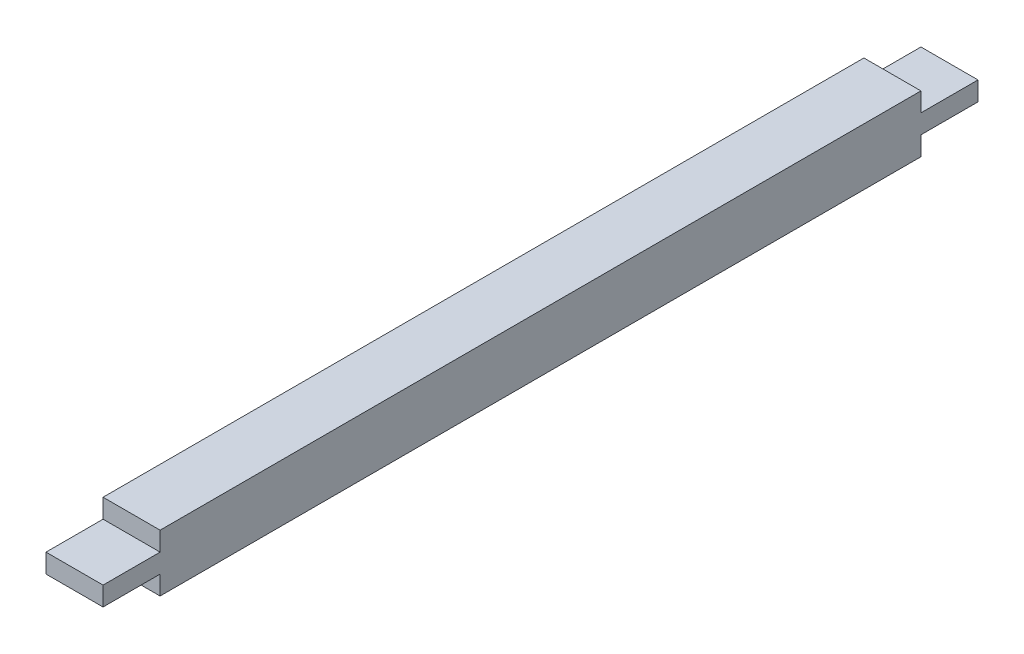
ISO-10303-21;
HEADER;
FILE_DESCRIPTION(('STEP AP214'),'2;1');
FILE_NAME('part.step','',(''),(''),'','','');
FILE_SCHEMA(('AUTOMOTIVE_DESIGN { 1 0 10303 214 1 1 1 1 }'));
ENDSEC;
DATA;
#1=APPLICATION_CONTEXT('core data for automotive mechanical design processes');
#2=APPLICATION_PROTOCOL_DEFINITION('international standard','automotive_design',2000,#1);
#3=PRODUCT_CONTEXT('',#1,'mechanical');
#4=PRODUCT('Part','Part','',(#3));
#5=PRODUCT_RELATED_PRODUCT_CATEGORY('part','',(#4));
#6=PRODUCT_DEFINITION_FORMATION('','',#4);
#7=PRODUCT_DEFINITION_CONTEXT('part definition',#1,'design');
#8=PRODUCT_DEFINITION('design','',#6,#7);
#9=PRODUCT_DEFINITION_SHAPE('','',#8);
#10=(LENGTH_UNIT() NAMED_UNIT(*) SI_UNIT(.MILLI.,.METRE.));
#11=(NAMED_UNIT(*) PLANE_ANGLE_UNIT() SI_UNIT($,.RADIAN.));
#12=(NAMED_UNIT(*) SI_UNIT($,.STERADIAN.) SOLID_ANGLE_UNIT());
#13=UNCERTAINTY_MEASURE_WITH_UNIT(LENGTH_MEASURE(1.E-05),#10,'distance_accuracy_value','');
#14=(GEOMETRIC_REPRESENTATION_CONTEXT(3) GLOBAL_UNCERTAINTY_ASSIGNED_CONTEXT((#13)) GLOBAL_UNIT_ASSIGNED_CONTEXT((#10,
#11,#12)) REPRESENTATION_CONTEXT('',''));
#15=CARTESIAN_POINT('',(0.,0.,0.));
#16=DIRECTION('',(0.,0.,1.));
#17=DIRECTION('',(1.,0.,0.));
#18=AXIS2_PLACEMENT_3D('',#15,#16,#17);
#19=CARTESIAN_POINT('',(0.,5.,0.));
#20=DIRECTION('',(0.,-1.,0.));
#21=DIRECTION('',(0.,0.,-1.));
#22=AXIS2_PLACEMENT_3D('',#19,#20,#21);
#23=PLANE('',#22);
#24=DIRECTION('',(-1.,0.,0.));
#25=VECTOR('',#24,1.);
#26=CARTESIAN_POINT('',(0.,5.,-200.));
#27=LINE('',#26,#25);
#28=CARTESIAN_POINT('',(-150.002980915945,5.,-200.));
#29=VERTEX_POINT('',#28);
#30=CARTESIAN_POINT('',(-179.997019084055,5.,-200.));
#31=VERTEX_POINT('',#30);
#32=EDGE_CURVE('E148',#29,#31,#27,.T.);
#33=ORIENTED_EDGE('',*,*,#32,.F.);
#34=DIRECTION('',(0.,0.,-1.));
#35=VECTOR('',#34,1.);
#36=CARTESIAN_POINT('',(-150.002980915945,5.,230.));
#37=LINE('',#36,#35);
#38=CARTESIAN_POINT('',(-150.002980915945,5.,-230.));
#39=VERTEX_POINT('',#38);
#40=EDGE_CURVE('E145',#29,#39,#37,.T.);
#41=ORIENTED_EDGE('',*,*,#40,.T.);
#42=DIRECTION('',(-1.,0.,0.));
#43=VECTOR('',#42,1.);
#44=CARTESIAN_POINT('',(-179.997019084055,5.,-230.));
#45=LINE('',#44,#43);
#46=CARTESIAN_POINT('',(-179.997019084055,5.,-230.));
#47=VERTEX_POINT('',#46);
#48=EDGE_CURVE('E157',#39,#47,#45,.T.);
#49=ORIENTED_EDGE('',*,*,#48,.T.);
#50=DIRECTION('',(0.,0.,1.));
#51=VECTOR('',#50,1.);
#52=CARTESIAN_POINT('',(-179.997019084055,5.,230.));
#53=LINE('',#52,#51);
#54=EDGE_CURVE('E56',#47,#31,#53,.T.);
#55=ORIENTED_EDGE('',*,*,#54,.T.);
#56=EDGE_LOOP('',(#33,#41,#49,#55));
#57=FACE_BOUND('',#56,.T.);
#58=ADVANCED_FACE('F33',(#57),#23,.F.);
#59=DIRECTION('',(1.,0.,0.));
#60=VECTOR('',#59,1.);
#61=CARTESIAN_POINT('',(0.,5.,200.));
#62=LINE('',#61,#60);
#63=CARTESIAN_POINT('',(-179.997019084055,5.,200.));
#64=VERTEX_POINT('',#63);
#65=CARTESIAN_POINT('',(-150.002980915945,5.,200.));
#66=VERTEX_POINT('',#65);
#67=EDGE_CURVE('E48',#64,#66,#62,.T.);
#68=ORIENTED_EDGE('',*,*,#67,.F.);
#69=CARTESIAN_POINT('',(-179.997019084055,5.,230.));
#70=VERTEX_POINT('',#69);
#71=EDGE_CURVE('E159',#64,#70,#53,.T.);
#72=ORIENTED_EDGE('',*,*,#71,.T.);
#73=DIRECTION('',(1.,0.,0.));
#74=VECTOR('',#73,1.);
#75=CARTESIAN_POINT('',(-179.997019084055,5.,230.));
#76=LINE('',#75,#74);
#77=CARTESIAN_POINT('',(-150.002980915945,5.,230.));
#78=VERTEX_POINT('',#77);
#79=EDGE_CURVE('E161',#70,#78,#76,.T.);
#80=ORIENTED_EDGE('',*,*,#79,.T.);
#81=EDGE_CURVE('E155',#78,#66,#37,.T.);
#82=ORIENTED_EDGE('',*,*,#81,.T.);
#83=EDGE_LOOP('',(#68,#72,#80,#82));
#84=FACE_BOUND('',#83,.T.);
#85=ADVANCED_FACE('F240',(#84),#23,.F.);
#86=CARTESIAN_POINT('',(0.,-5.,0.));
#87=DIRECTION('',(0.,-1.,0.));
#88=DIRECTION('',(0.,0.,-1.));
#89=AXIS2_PLACEMENT_3D('',#86,#87,#88);
#90=PLANE('',#89);
#91=DIRECTION('',(0.,0.,-1.));
#92=VECTOR('',#91,1.);
#93=CARTESIAN_POINT('',(-150.002980915945,-5.,230.));
#94=LINE('',#93,#92);
#95=CARTESIAN_POINT('',(-150.002980915945,-5.,-200.));
#96=VERTEX_POINT('',#95);
#97=CARTESIAN_POINT('',(-150.002980915945,-5.,-230.));
#98=VERTEX_POINT('',#97);
#99=EDGE_CURVE('E154',#96,#98,#94,.T.);
#100=ORIENTED_EDGE('',*,*,#99,.F.);
#101=DIRECTION('',(-1.,0.,0.));
#102=VECTOR('',#101,1.);
#103=CARTESIAN_POINT('',(0.,-5.,-200.));
#104=LINE('',#103,#102);
#105=CARTESIAN_POINT('',(-179.997019084055,-5.,-200.));
#106=VERTEX_POINT('',#105);
#107=EDGE_CURVE('E11',#96,#106,#104,.T.);
#108=ORIENTED_EDGE('',*,*,#107,.T.);
#109=DIRECTION('',(0.,0.,1.));
#110=VECTOR('',#109,1.);
#111=CARTESIAN_POINT('',(-179.997019084055,-5.,230.));
#112=LINE('',#111,#110);
#113=CARTESIAN_POINT('',(-179.997019084055,-5.,-230.));
#114=VERTEX_POINT('',#113);
#115=EDGE_CURVE('E170',#114,#106,#112,.T.);
#116=ORIENTED_EDGE('',*,*,#115,.F.);
#117=DIRECTION('',(-1.,0.,0.));
#118=VECTOR('',#117,1.);
#119=CARTESIAN_POINT('',(-179.997019084055,-5.,-230.));
#120=LINE('',#119,#118);
#121=EDGE_CURVE('E167',#98,#114,#120,.T.);
#122=ORIENTED_EDGE('',*,*,#121,.F.);
#123=EDGE_LOOP('',(#100,#108,#116,#122));
#124=FACE_BOUND('',#123,.T.);
#125=ADVANCED_FACE('F245',(#124),#90,.T.);
#126=CARTESIAN_POINT('',(-179.997019084055,-5.,200.));
#127=VERTEX_POINT('',#126);
#128=CARTESIAN_POINT('',(-179.997019084055,-5.,230.));
#129=VERTEX_POINT('',#128);
#130=EDGE_CURVE('E169',#127,#129,#112,.T.);
#131=ORIENTED_EDGE('',*,*,#130,.F.);
#132=DIRECTION('',(1.,0.,0.));
#133=VECTOR('',#132,1.);
#134=CARTESIAN_POINT('',(0.,-5.,200.));
#135=LINE('',#134,#133);
#136=CARTESIAN_POINT('',(-150.002980915945,-5.,200.));
#137=VERTEX_POINT('',#136);
#138=EDGE_CURVE('E41',#127,#137,#135,.T.);
#139=ORIENTED_EDGE('',*,*,#138,.T.);
#140=CARTESIAN_POINT('',(-150.002980915945,-5.,230.));
#141=VERTEX_POINT('',#140);
#142=EDGE_CURVE('E164',#141,#137,#94,.T.);
#143=ORIENTED_EDGE('',*,*,#142,.F.);
#144=DIRECTION('',(1.,0.,0.));
#145=VECTOR('',#144,1.);
#146=CARTESIAN_POINT('',(-179.997019084055,-5.,230.));
#147=LINE('',#146,#145);
#148=EDGE_CURVE('E173',#129,#141,#147,.T.);
#149=ORIENTED_EDGE('',*,*,#148,.F.);
#150=EDGE_LOOP('',(#131,#139,#143,#149));
#151=FACE_BOUND('',#150,.T.);
#152=ADVANCED_FACE('F189',(#151),#90,.T.);
#153=CARTESIAN_POINT('',(-150.002980915945,5.,230.));
#154=DIRECTION('',(-1.,0.,0.));
#155=DIRECTION('',(0.,0.,1.));
#156=AXIS2_PLACEMENT_3D('',#153,#154,#155);
#157=PLANE('',#156);
#158=DIRECTION('',(0.,-1.,0.));
#159=VECTOR('',#158,1.);
#160=CARTESIAN_POINT('',(-150.002980915945,15.,200.));
#161=LINE('',#160,#159);
#162=CARTESIAN_POINT('',(-150.002980915945,15.,200.));
#163=VERTEX_POINT('',#162);
#164=EDGE_CURVE('E212',#163,#66,#161,.T.);
#165=ORIENTED_EDGE('',*,*,#164,.T.);
#166=ORIENTED_EDGE('',*,*,#81,.F.);
#167=DIRECTION('',(0.,-1.,0.));
#168=VECTOR('',#167,1.);
#169=CARTESIAN_POINT('',(-150.002980915945,5.,230.));
#170=LINE('',#169,#168);
#171=EDGE_CURVE('E163',#78,#141,#170,.T.);
#172=ORIENTED_EDGE('',*,*,#171,.T.);
#173=ORIENTED_EDGE('',*,*,#142,.T.);
#174=CARTESIAN_POINT('',(-150.002980915945,-15.,200.));
#175=VERTEX_POINT('',#174);
#176=EDGE_CURVE('E194',#137,#175,#161,.T.);
#177=ORIENTED_EDGE('',*,*,#176,.T.);
#178=DIRECTION('',(0.,0.,-1.));
#179=VECTOR('',#178,1.);
#180=CARTESIAN_POINT('',(-150.002980915945,-15.,200.));
#181=LINE('',#180,#179);
#182=CARTESIAN_POINT('',(-150.002980915945,-15.,-200.));
#183=VERTEX_POINT('',#182);
#184=EDGE_CURVE('E221',#175,#183,#181,.T.);
#185=ORIENTED_EDGE('',*,*,#184,.T.);
#186=DIRECTION('',(0.,-1.,0.));
#187=VECTOR('',#186,1.);
#188=CARTESIAN_POINT('',(-150.002980915945,15.,-200.));
#189=LINE('',#188,#187);
#190=EDGE_CURVE('E146',#96,#183,#189,.T.);
#191=ORIENTED_EDGE('',*,*,#190,.F.);
#192=ORIENTED_EDGE('',*,*,#99,.T.);
#193=DIRECTION('',(0.,-1.,0.));
#194=VECTOR('',#193,1.);
#195=CARTESIAN_POINT('',(-150.002980915945,5.,-230.));
#196=LINE('',#195,#194);
#197=EDGE_CURVE('E183',#39,#98,#196,.T.);
#198=ORIENTED_EDGE('',*,*,#197,.F.);
#199=ORIENTED_EDGE('',*,*,#40,.F.);
#200=CARTESIAN_POINT('',(-150.002980915945,15.,-200.));
#201=VERTEX_POINT('',#200);
#202=EDGE_CURVE('E126',#201,#29,#189,.T.);
#203=ORIENTED_EDGE('',*,*,#202,.F.);
#204=DIRECTION('',(0.,0.,-1.));
#205=VECTOR('',#204,1.);
#206=CARTESIAN_POINT('',(-150.002980915945,15.,200.));
#207=LINE('',#206,#205);
#208=EDGE_CURVE('E132',#163,#201,#207,.T.);
#209=ORIENTED_EDGE('',*,*,#208,.F.);
#210=EDGE_LOOP('',(#165,#166,#172,#173,#177,#185,#191,#192,#198,#199,#203,#209));
#211=FACE_BOUND('',#210,.T.);
#212=ADVANCED_FACE('F35',(#211),#157,.F.);
#213=CARTESIAN_POINT('',(-179.997019084055,5.,-230.));
#214=DIRECTION('',(0.,0.,1.));
#215=DIRECTION('',(1.,0.,0.));
#216=AXIS2_PLACEMENT_3D('',#213,#214,#215);
#217=PLANE('',#216);
#218=ORIENTED_EDGE('',*,*,#121,.T.);
#219=DIRECTION('',(0.,-1.,0.));
#220=VECTOR('',#219,1.);
#221=CARTESIAN_POINT('',(-179.997019084055,5.,-230.));
#222=LINE('',#221,#220);
#223=EDGE_CURVE('E180',#47,#114,#222,.T.);
#224=ORIENTED_EDGE('',*,*,#223,.F.);
#225=ORIENTED_EDGE('',*,*,#48,.F.);
#226=ORIENTED_EDGE('',*,*,#197,.T.);
#227=EDGE_LOOP('',(#218,#224,#225,#226));
#228=FACE_BOUND('',#227,.T.);
#229=ADVANCED_FACE('F253',(#228),#217,.F.);
#230=CARTESIAN_POINT('',(-179.997019084055,5.,230.));
#231=DIRECTION('',(1.,0.,0.));
#232=DIRECTION('',(0.,0.,-1.));
#233=AXIS2_PLACEMENT_3D('',#230,#231,#232);
#234=PLANE('',#233);
#235=DIRECTION('',(0.,-1.,0.));
#236=VECTOR('',#235,1.);
#237=CARTESIAN_POINT('',(-179.997019084055,15.,200.));
#238=LINE('',#237,#236);
#239=CARTESIAN_POINT('',(-179.997019084055,-15.,200.));
#240=VERTEX_POINT('',#239);
#241=EDGE_CURVE('E207',#127,#240,#238,.T.);
#242=ORIENTED_EDGE('',*,*,#241,.F.);
#243=ORIENTED_EDGE('',*,*,#130,.T.);
#244=DIRECTION('',(0.,-1.,0.));
#245=VECTOR('',#244,1.);
#246=CARTESIAN_POINT('',(-179.997019084055,5.,230.));
#247=LINE('',#246,#245);
#248=EDGE_CURVE('E177',#70,#129,#247,.T.);
#249=ORIENTED_EDGE('',*,*,#248,.F.);
#250=ORIENTED_EDGE('',*,*,#71,.F.);
#251=CARTESIAN_POINT('',(-179.997019084055,15.,200.));
#252=VERTEX_POINT('',#251);
#253=EDGE_CURVE('E211',#252,#64,#238,.T.);
#254=ORIENTED_EDGE('',*,*,#253,.F.);
#255=DIRECTION('',(0.,0.,1.));
#256=VECTOR('',#255,1.);
#257=CARTESIAN_POINT('',(-179.997019084055,15.,200.));
#258=LINE('',#257,#256);
#259=CARTESIAN_POINT('',(-179.997019084055,15.,-200.));
#260=VERTEX_POINT('',#259);
#261=EDGE_CURVE('E131',#260,#252,#258,.T.);
#262=ORIENTED_EDGE('',*,*,#261,.F.);
#263=DIRECTION('',(0.,-1.,0.));
#264=VECTOR('',#263,1.);
#265=CARTESIAN_POINT('',(-179.997019084055,15.,-200.));
#266=LINE('',#265,#264);
#267=EDGE_CURVE('E128',#260,#31,#266,.T.);
#268=ORIENTED_EDGE('',*,*,#267,.T.);
#269=ORIENTED_EDGE('',*,*,#54,.F.);
#270=ORIENTED_EDGE('',*,*,#223,.T.);
#271=ORIENTED_EDGE('',*,*,#115,.T.);
#272=CARTESIAN_POINT('',(-179.997019084055,-15.,-200.));
#273=VERTEX_POINT('',#272);
#274=EDGE_CURVE('E213',#106,#273,#266,.T.);
#275=ORIENTED_EDGE('',*,*,#274,.T.);
#276=DIRECTION('',(0.,0.,1.));
#277=VECTOR('',#276,1.);
#278=CARTESIAN_POINT('',(-179.997019084055,-15.,200.));
#279=LINE('',#278,#277);
#280=EDGE_CURVE('E209',#273,#240,#279,.T.);
#281=ORIENTED_EDGE('',*,*,#280,.T.);
#282=EDGE_LOOP('',(#242,#243,#249,#250,#254,#262,#268,#269,#270,#271,#275,#281));
#283=FACE_BOUND('',#282,.T.);
#284=ADVANCED_FACE('F203',(#283),#234,.F.);
#285=CARTESIAN_POINT('',(-179.997019084055,5.,230.));
#286=DIRECTION('',(0.,0.,-1.));
#287=DIRECTION('',(-1.,0.,0.));
#288=AXIS2_PLACEMENT_3D('',#285,#286,#287);
#289=PLANE('',#288);
#290=ORIENTED_EDGE('',*,*,#148,.T.);
#291=ORIENTED_EDGE('',*,*,#171,.F.);
#292=ORIENTED_EDGE('',*,*,#79,.F.);
#293=ORIENTED_EDGE('',*,*,#248,.T.);
#294=EDGE_LOOP('',(#290,#291,#292,#293));
#295=FACE_BOUND('',#294,.T.);
#296=ADVANCED_FACE('F200',(#295),#289,.F.);
#297=CARTESIAN_POINT('',(0.,-15.,0.));
#298=DIRECTION('',(0.,-1.,0.));
#299=DIRECTION('',(0.,0.,-1.));
#300=AXIS2_PLACEMENT_3D('',#297,#298,#299);
#301=PLANE('',#300);
#302=ORIENTED_EDGE('',*,*,#184,.F.);
#303=DIRECTION('',(1.,0.,0.));
#304=VECTOR('',#303,1.);
#305=CARTESIAN_POINT('',(-179.997019084055,-15.,200.));
#306=LINE('',#305,#304);
#307=EDGE_CURVE('E141',#240,#175,#306,.T.);
#308=ORIENTED_EDGE('',*,*,#307,.F.);
#309=ORIENTED_EDGE('',*,*,#280,.F.);
#310=DIRECTION('',(-1.,0.,0.));
#311=VECTOR('',#310,1.);
#312=CARTESIAN_POINT('',(-179.997019084055,-15.,-200.));
#313=LINE('',#312,#311);
#314=EDGE_CURVE('E218',#183,#273,#313,.T.);
#315=ORIENTED_EDGE('',*,*,#314,.F.);
#316=EDGE_LOOP('',(#302,#308,#309,#315));
#317=FACE_BOUND('',#316,.T.);
#318=ADVANCED_FACE('F238',(#317),#301,.T.);
#319=CARTESIAN_POINT('',(-179.997019084055,15.,200.));
#320=DIRECTION('',(0.,0.,-1.));
#321=DIRECTION('',(-1.,0.,0.));
#322=AXIS2_PLACEMENT_3D('',#319,#320,#321);
#323=PLANE('',#322);
#324=ORIENTED_EDGE('',*,*,#138,.F.);
#325=ORIENTED_EDGE('',*,*,#241,.T.);
#326=ORIENTED_EDGE('',*,*,#307,.T.);
#327=ORIENTED_EDGE('',*,*,#176,.F.);
#328=EDGE_LOOP('',(#324,#325,#326,#327));
#329=FACE_BOUND('',#328,.T.);
#330=ADVANCED_FACE('F228',(#329),#323,.F.);
#331=CARTESIAN_POINT('',(-179.997019084055,15.,-200.));
#332=DIRECTION('',(0.,0.,1.));
#333=DIRECTION('',(1.,0.,0.));
#334=AXIS2_PLACEMENT_3D('',#331,#332,#333);
#335=PLANE('',#334);
#336=ORIENTED_EDGE('',*,*,#107,.F.);
#337=ORIENTED_EDGE('',*,*,#190,.T.);
#338=ORIENTED_EDGE('',*,*,#314,.T.);
#339=ORIENTED_EDGE('',*,*,#274,.F.);
#340=EDGE_LOOP('',(#336,#337,#338,#339));
#341=FACE_BOUND('',#340,.T.);
#342=ADVANCED_FACE('F234',(#341),#335,.F.);
#343=ORIENTED_EDGE('',*,*,#202,.T.);
#344=ORIENTED_EDGE('',*,*,#32,.T.);
#345=ORIENTED_EDGE('',*,*,#267,.F.);
#346=DIRECTION('',(-1.,0.,0.));
#347=VECTOR('',#346,1.);
#348=CARTESIAN_POINT('',(-179.997019084055,15.,-200.));
#349=LINE('',#348,#347);
#350=EDGE_CURVE('E122',#201,#260,#349,.T.);
#351=ORIENTED_EDGE('',*,*,#350,.F.);
#352=EDGE_LOOP('',(#343,#344,#345,#351));
#353=FACE_BOUND('',#352,.T.);
#354=ADVANCED_FACE('F124',(#353),#335,.F.);
#355=ORIENTED_EDGE('',*,*,#253,.T.);
#356=ORIENTED_EDGE('',*,*,#67,.T.);
#357=ORIENTED_EDGE('',*,*,#164,.F.);
#358=DIRECTION('',(1.,0.,0.));
#359=VECTOR('',#358,1.);
#360=CARTESIAN_POINT('',(-179.997019084055,15.,200.));
#361=LINE('',#360,#359);
#362=EDGE_CURVE('E137',#252,#163,#361,.T.);
#363=ORIENTED_EDGE('',*,*,#362,.F.);
#364=EDGE_LOOP('',(#355,#356,#357,#363));
#365=FACE_BOUND('',#364,.T.);
#366=ADVANCED_FACE('F225',(#365),#323,.F.);
#367=CARTESIAN_POINT('',(0.,15.,0.));
#368=DIRECTION('',(0.,-1.,0.));
#369=DIRECTION('',(0.,0.,-1.));
#370=AXIS2_PLACEMENT_3D('',#367,#368,#369);
#371=PLANE('',#370);
#372=ORIENTED_EDGE('',*,*,#208,.T.);
#373=ORIENTED_EDGE('',*,*,#350,.T.);
#374=ORIENTED_EDGE('',*,*,#261,.T.);
#375=ORIENTED_EDGE('',*,*,#362,.T.);
#376=EDGE_LOOP('',(#372,#373,#374,#375));
#377=FACE_BOUND('',#376,.T.);
#378=ADVANCED_FACE('F135',(#377),#371,.F.);
#379=CLOSED_SHELL('',(#58,#85,#125,#152,#212,#229,#284,#296,#318,#330,#342,#354,#366,#378));
#380=MANIFOLD_SOLID_BREP('B2',#379);
#381=ADVANCED_BREP_SHAPE_REPRESENTATION('',(#18,#380),#14);
#382=SHAPE_DEFINITION_REPRESENTATION(#9,#381);
ENDSEC;
END-ISO-10303-21;
